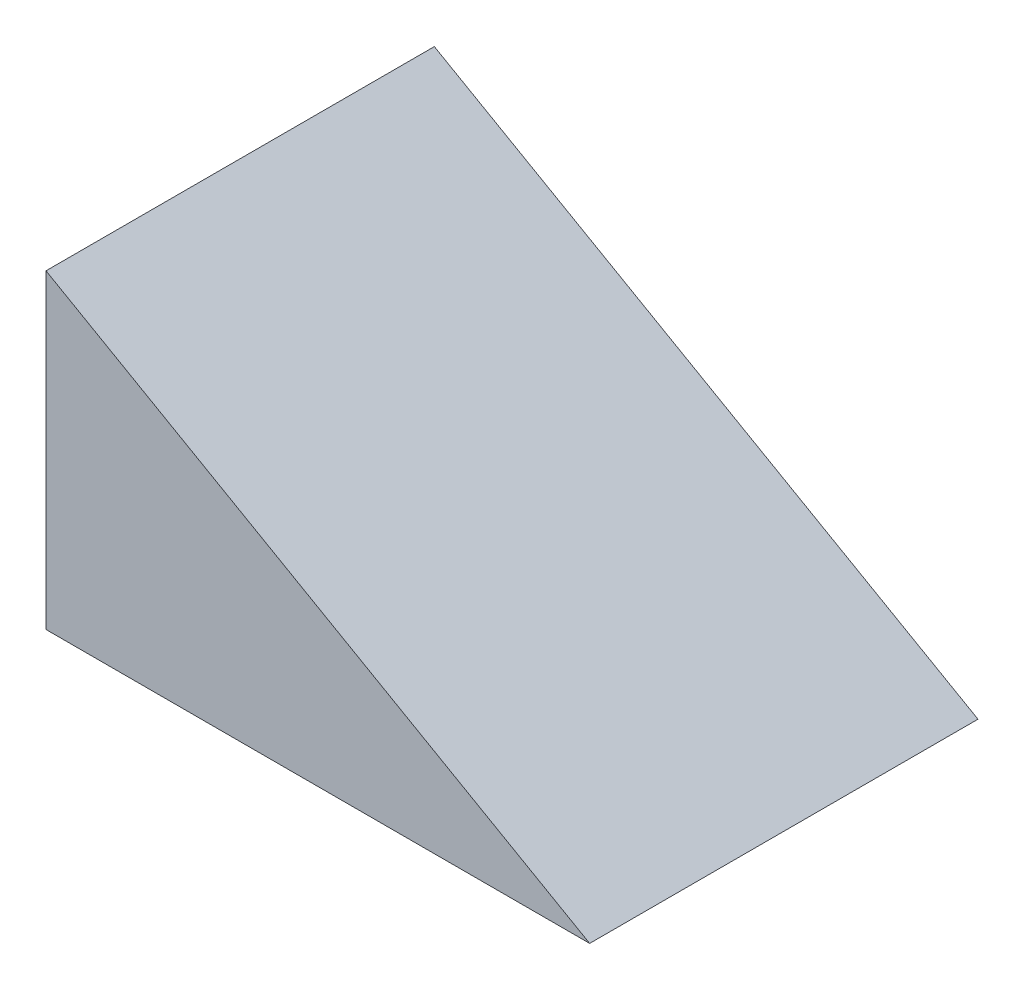
ISO-10303-21;
HEADER;
FILE_DESCRIPTION(('STEP AP214'),'2;1');
FILE_NAME('part.step','',(''),(''),'','','');
FILE_SCHEMA(('AUTOMOTIVE_DESIGN { 1 0 10303 214 1 1 1 1 }'));
ENDSEC;
DATA;
#1=APPLICATION_CONTEXT('core data for automotive mechanical design processes');
#2=APPLICATION_PROTOCOL_DEFINITION('international standard','automotive_design',2000,#1);
#3=PRODUCT_CONTEXT('',#1,'mechanical');
#4=PRODUCT('Part','Part','',(#3));
#5=PRODUCT_RELATED_PRODUCT_CATEGORY('part','',(#4));
#6=PRODUCT_DEFINITION_FORMATION('','',#4);
#7=PRODUCT_DEFINITION_CONTEXT('part definition',#1,'design');
#8=PRODUCT_DEFINITION('design','',#6,#7);
#9=PRODUCT_DEFINITION_SHAPE('','',#8);
#10=(LENGTH_UNIT() NAMED_UNIT(*) SI_UNIT(.MILLI.,.METRE.));
#11=(NAMED_UNIT(*) PLANE_ANGLE_UNIT() SI_UNIT($,.RADIAN.));
#12=(NAMED_UNIT(*) SI_UNIT($,.STERADIAN.) SOLID_ANGLE_UNIT());
#13=UNCERTAINTY_MEASURE_WITH_UNIT(LENGTH_MEASURE(1.E-05),#10,'distance_accuracy_value','');
#14=(GEOMETRIC_REPRESENTATION_CONTEXT(3) GLOBAL_UNCERTAINTY_ASSIGNED_CONTEXT((#13)) GLOBAL_UNIT_ASSIGNED_CONTEXT((#10,
#11,#12)) REPRESENTATION_CONTEXT('',''));
#15=CARTESIAN_POINT('',(0.,0.,0.));
#16=DIRECTION('',(0.,0.,1.));
#17=DIRECTION('',(1.,0.,0.));
#18=AXIS2_PLACEMENT_3D('',#15,#16,#17);
#19=CARTESIAN_POINT('',(70.,0.,50.));
#20=DIRECTION('',(0.,1.,0.));
#21=DIRECTION('',(-1.,0.,0.));
#22=AXIS2_PLACEMENT_3D('',#19,#20,#21);
#23=PLANE('',#22);
#24=DIRECTION('',(1.,0.,0.));
#25=VECTOR('',#24,1.);
#26=CARTESIAN_POINT('',(70.,0.,0.));
#27=LINE('',#26,#25);
#28=CARTESIAN_POINT('',(0.,0.,0.));
#29=VERTEX_POINT('',#28);
#30=CARTESIAN_POINT('',(70.,0.,0.));
#31=VERTEX_POINT('',#30);
#32=EDGE_CURVE('E89',#29,#31,#27,.T.);
#33=ORIENTED_EDGE('',*,*,#32,.T.);
#34=DIRECTION('',(0.,0.,-1.));
#35=VECTOR('',#34,1.);
#36=CARTESIAN_POINT('',(70.,0.,50.));
#37=LINE('',#36,#35);
#38=CARTESIAN_POINT('',(70.,0.,50.));
#39=VERTEX_POINT('',#38);
#40=EDGE_CURVE('E11',#39,#31,#37,.T.);
#41=ORIENTED_EDGE('',*,*,#40,.F.);
#42=DIRECTION('',(1.,0.,0.));
#43=VECTOR('',#42,1.);
#44=CARTESIAN_POINT('',(70.,0.,50.));
#45=LINE('',#44,#43);
#46=CARTESIAN_POINT('',(0.,0.,50.));
#47=VERTEX_POINT('',#46);
#48=EDGE_CURVE('E81',#47,#39,#45,.T.);
#49=ORIENTED_EDGE('',*,*,#48,.F.);
#50=DIRECTION('',(0.,0.,-1.));
#51=VECTOR('',#50,1.);
#52=CARTESIAN_POINT('',(0.,0.,50.));
#53=LINE('',#52,#51);
#54=EDGE_CURVE('E90',#47,#29,#53,.T.);
#55=ORIENTED_EDGE('',*,*,#54,.T.);
#56=EDGE_LOOP('',(#33,#41,#49,#55));
#57=FACE_BOUND('',#56,.T.);
#58=ADVANCED_FACE('F39',(#57),#23,.F.);
#59=CARTESIAN_POINT('',(0.,40.,50.));
#60=DIRECTION('',(-0.496138938356834,-0.868243142124459,0.));
#61=DIRECTION('',(0.868243142124459,-0.496138938356834,0.));
#62=AXIS2_PLACEMENT_3D('',#59,#60,#61);
#63=PLANE('',#62);
#64=DIRECTION('',(-0.868243142124459,0.496138938356834,0.));
#65=VECTOR('',#64,1.);
#66=CARTESIAN_POINT('',(0.,40.,0.));
#67=LINE('',#66,#65);
#68=CARTESIAN_POINT('',(0.,40.,0.));
#69=VERTEX_POINT('',#68);
#70=EDGE_CURVE('E68',#31,#69,#67,.T.);
#71=ORIENTED_EDGE('',*,*,#70,.T.);
#72=DIRECTION('',(0.,0.,-1.));
#73=VECTOR('',#72,1.);
#74=CARTESIAN_POINT('',(0.,40.,50.));
#75=LINE('',#74,#73);
#76=CARTESIAN_POINT('',(0.,40.,50.));
#77=VERTEX_POINT('',#76);
#78=EDGE_CURVE('E48',#77,#69,#75,.T.);
#79=ORIENTED_EDGE('',*,*,#78,.F.);
#80=DIRECTION('',(-0.868243142124459,0.496138938356834,0.));
#81=VECTOR('',#80,1.);
#82=CARTESIAN_POINT('',(0.,40.,50.));
#83=LINE('',#82,#81);
#84=EDGE_CURVE('E76',#39,#77,#83,.T.);
#85=ORIENTED_EDGE('',*,*,#84,.F.);
#86=ORIENTED_EDGE('',*,*,#40,.T.);
#87=EDGE_LOOP('',(#71,#79,#85,#86));
#88=FACE_BOUND('',#87,.T.);
#89=ADVANCED_FACE('F77',(#88),#63,.F.);
#90=CARTESIAN_POINT('',(0.,0.,50.));
#91=DIRECTION('',(1.,0.,0.));
#92=DIRECTION('',(0.,0.,-1.));
#93=AXIS2_PLACEMENT_3D('',#90,#91,#92);
#94=PLANE('',#93);
#95=DIRECTION('',(0.,-1.,0.));
#96=VECTOR('',#95,1.);
#97=CARTESIAN_POINT('',(0.,0.,0.));
#98=LINE('',#97,#96);
#99=EDGE_CURVE('E73',#69,#29,#98,.T.);
#100=ORIENTED_EDGE('',*,*,#99,.T.);
#101=ORIENTED_EDGE('',*,*,#54,.F.);
#102=DIRECTION('',(0.,-1.,0.));
#103=VECTOR('',#102,1.);
#104=CARTESIAN_POINT('',(0.,0.,50.));
#105=LINE('',#104,#103);
#106=EDGE_CURVE('E56',#77,#47,#105,.T.);
#107=ORIENTED_EDGE('',*,*,#106,.F.);
#108=ORIENTED_EDGE('',*,*,#78,.T.);
#109=EDGE_LOOP('',(#100,#101,#107,#108));
#110=FACE_BOUND('',#109,.T.);
#111=ADVANCED_FACE('F102',(#110),#94,.F.);
#112=CARTESIAN_POINT('',(0.,0.,50.));
#113=DIRECTION('',(0.,0.,-1.));
#114=DIRECTION('',(-1.,0.,0.));
#115=AXIS2_PLACEMENT_3D('',#112,#113,#114);
#116=PLANE('',#115);
#117=ORIENTED_EDGE('',*,*,#48,.T.);
#118=ORIENTED_EDGE('',*,*,#84,.T.);
#119=ORIENTED_EDGE('',*,*,#106,.T.);
#120=EDGE_LOOP('',(#117,#118,#119));
#121=FACE_BOUND('',#120,.T.);
#122=ADVANCED_FACE('F84',(#121),#116,.F.);
#123=CARTESIAN_POINT('',(0.,0.,0.));
#124=DIRECTION('',(0.,0.,-1.));
#125=DIRECTION('',(-1.,0.,0.));
#126=AXIS2_PLACEMENT_3D('',#123,#124,#125);
#127=PLANE('',#126);
#128=ORIENTED_EDGE('',*,*,#32,.F.);
#129=ORIENTED_EDGE('',*,*,#99,.F.);
#130=ORIENTED_EDGE('',*,*,#70,.F.);
#131=EDGE_LOOP('',(#128,#129,#130));
#132=FACE_BOUND('',#131,.T.);
#133=ADVANCED_FACE('F103',(#132),#127,.T.);
#134=CLOSED_SHELL('',(#58,#89,#111,#122,#133));
#135=MANIFOLD_SOLID_BREP('B2',#134);
#136=ADVANCED_BREP_SHAPE_REPRESENTATION('',(#18,#135),#14);
#137=SHAPE_DEFINITION_REPRESENTATION(#9,#136);
ENDSEC;
END-ISO-10303-21;
